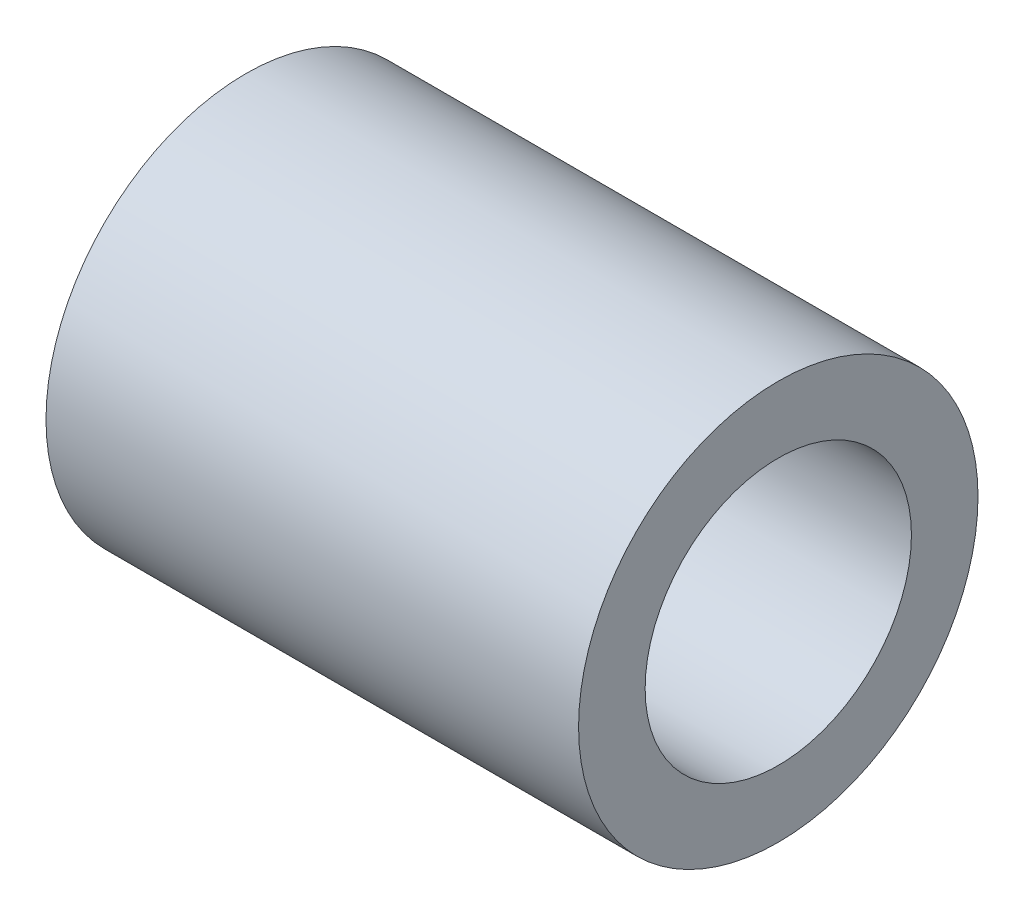
ISO-10303-21;
HEADER;
FILE_DESCRIPTION(('STEP AP214'),'2;1');
FILE_NAME('part.step','',(''),(''),'','','');
FILE_SCHEMA(('AUTOMOTIVE_DESIGN { 1 0 10303 214 1 1 1 1 }'));
ENDSEC;
DATA;
#1=APPLICATION_CONTEXT('core data for automotive mechanical design processes');
#2=APPLICATION_PROTOCOL_DEFINITION('international standard','automotive_design',2000,#1);
#3=PRODUCT_CONTEXT('',#1,'mechanical');
#4=PRODUCT('Part','Part','',(#3));
#5=PRODUCT_RELATED_PRODUCT_CATEGORY('part','',(#4));
#6=PRODUCT_DEFINITION_FORMATION('','',#4);
#7=PRODUCT_DEFINITION_CONTEXT('part definition',#1,'design');
#8=PRODUCT_DEFINITION('design','',#6,#7);
#9=PRODUCT_DEFINITION_SHAPE('','',#8);
#10=(LENGTH_UNIT() NAMED_UNIT(*) SI_UNIT(.MILLI.,.METRE.));
#11=(NAMED_UNIT(*) PLANE_ANGLE_UNIT() SI_UNIT($,.RADIAN.));
#12=(NAMED_UNIT(*) SI_UNIT($,.STERADIAN.) SOLID_ANGLE_UNIT());
#13=UNCERTAINTY_MEASURE_WITH_UNIT(LENGTH_MEASURE(1.E-05),#10,'distance_accuracy_value','');
#14=(GEOMETRIC_REPRESENTATION_CONTEXT(3) GLOBAL_UNCERTAINTY_ASSIGNED_CONTEXT((#13)) GLOBAL_UNIT_ASSIGNED_CONTEXT((#10,
#11,#12)) REPRESENTATION_CONTEXT('',''));
#15=CARTESIAN_POINT('',(0.,0.,0.));
#16=DIRECTION('',(0.,0.,1.));
#17=DIRECTION('',(1.,0.,0.));
#18=AXIS2_PLACEMENT_3D('',#15,#16,#17);
#19=CARTESIAN_POINT('',(4.7625,0.,0.));
#20=DIRECTION('',(1.,0.,0.));
#21=DIRECTION('',(0.,0.,-1.));
#22=AXIS2_PLACEMENT_3D('',#19,#20,#21);
#23=PLANE('',#22);
#24=CARTESIAN_POINT('',(4.7625,0.,0.));
#25=DIRECTION('',(1.,0.,0.));
#26=DIRECTION('',(0.,0.,-1.));
#27=AXIS2_PLACEMENT_3D('',#24,#25,#26);
#28=CIRCLE('',#27,3.571875);
#29=CARTESIAN_POINT('',(4.7625,0.,3.571875));
#30=VERTEX_POINT('',#29);
#31=EDGE_CURVE('E10',#30,#30,#28,.T.);
#32=ORIENTED_EDGE('',*,*,#31,.T.);
#33=EDGE_LOOP('',(#32));
#34=FACE_BOUND('',#33,.T.);
#35=CARTESIAN_POINT('',(4.7625,0.,0.));
#36=DIRECTION('',(1.,0.,0.));
#37=DIRECTION('',(0.,0.,-1.));
#38=AXIS2_PLACEMENT_3D('',#35,#36,#37);
#39=CIRCLE('',#38,2.38125);
#40=CARTESIAN_POINT('',(4.7625,0.,2.38125));
#41=VERTEX_POINT('',#40);
#42=EDGE_CURVE('E50',#41,#41,#39,.T.);
#43=ORIENTED_EDGE('',*,*,#42,.F.);
#44=EDGE_LOOP('',(#43));
#45=FACE_BOUND('',#44,.T.);
#46=ADVANCED_FACE('F35',(#34,#45),#23,.T.);
#47=CARTESIAN_POINT('',(-4.7625,0.,0.));
#48=DIRECTION('',(1.,0.,0.));
#49=DIRECTION('',(0.,0.,-1.));
#50=AXIS2_PLACEMENT_3D('',#47,#48,#49);
#51=PLANE('',#50);
#52=CARTESIAN_POINT('',(-4.7625,0.,0.));
#53=DIRECTION('',(1.,0.,0.));
#54=DIRECTION('',(0.,0.,-1.));
#55=AXIS2_PLACEMENT_3D('',#52,#53,#54);
#56=CIRCLE('',#55,3.571875);
#57=CARTESIAN_POINT('',(-4.7625,0.,3.571875));
#58=VERTEX_POINT('',#57);
#59=EDGE_CURVE('E39',#58,#58,#56,.T.);
#60=ORIENTED_EDGE('',*,*,#59,.F.);
#61=EDGE_LOOP('',(#60));
#62=FACE_BOUND('',#61,.T.);
#63=CARTESIAN_POINT('',(-4.7625,0.,0.));
#64=DIRECTION('',(1.,0.,0.));
#65=DIRECTION('',(0.,0.,-1.));
#66=AXIS2_PLACEMENT_3D('',#63,#64,#65);
#67=CIRCLE('',#66,2.38125);
#68=CARTESIAN_POINT('',(-4.7625,0.,2.38125));
#69=VERTEX_POINT('',#68);
#70=EDGE_CURVE('E52',#69,#69,#67,.T.);
#71=ORIENTED_EDGE('',*,*,#70,.T.);
#72=EDGE_LOOP('',(#71));
#73=FACE_BOUND('',#72,.T.);
#74=ADVANCED_FACE('F62',(#62,#73),#51,.F.);
#75=CARTESIAN_POINT('',(4.7625,0.,0.));
#76=DIRECTION('',(-1.,0.,0.));
#77=DIRECTION('',(0.,0.,1.));
#78=AXIS2_PLACEMENT_3D('',#75,#76,#77);
#79=CYLINDRICAL_SURFACE('',#78,3.571875);
#80=CARTESIAN_POINT('',(4.7625,0.,3.571875));
#81=CARTESIAN_POINT('',(4.66328125,0.,3.571875));
#82=CARTESIAN_POINT('',(4.5640625,0.,3.571875));
#83=CARTESIAN_POINT('',(4.365625,0.,3.571875));
#84=CARTESIAN_POINT('',(4.26640625,0.,3.571875));
#85=CARTESIAN_POINT('',(4.06796875,0.,3.571875));
#86=CARTESIAN_POINT('',(3.96875,0.,3.571875));
#87=CARTESIAN_POINT('',(3.7703125,0.,3.571875));
#88=CARTESIAN_POINT('',(3.67109375,0.,3.571875));
#89=CARTESIAN_POINT('',(3.47265625,0.,3.571875));
#90=CARTESIAN_POINT('',(3.3734375,0.,3.571875));
#91=CARTESIAN_POINT('',(3.175,0.,3.571875));
#92=CARTESIAN_POINT('',(3.07578125,0.,3.571875));
#93=CARTESIAN_POINT('',(2.87734375,0.,3.571875));
#94=CARTESIAN_POINT('',(2.778125,0.,3.571875));
#95=CARTESIAN_POINT('',(2.5796875,0.,3.571875));
#96=CARTESIAN_POINT('',(2.48046875,0.,3.571875));
#97=CARTESIAN_POINT('',(2.28203125,0.,3.571875));
#98=CARTESIAN_POINT('',(2.1828125,0.,3.571875));
#99=CARTESIAN_POINT('',(1.984375,0.,3.571875));
#100=CARTESIAN_POINT('',(1.88515625,0.,3.571875));
#101=CARTESIAN_POINT('',(1.68671875,0.,3.571875));
#102=CARTESIAN_POINT('',(1.5875,0.,3.571875));
#103=CARTESIAN_POINT('',(1.3890625,0.,3.571875));
#104=CARTESIAN_POINT('',(1.28984375,0.,3.571875));
#105=CARTESIAN_POINT('',(1.09140625,0.,3.571875));
#106=CARTESIAN_POINT('',(0.992187499999999,0.,3.571875));
#107=CARTESIAN_POINT('',(0.79375,0.,3.571875));
#108=CARTESIAN_POINT('',(0.69453125,0.,3.571875));
#109=CARTESIAN_POINT('',(0.49609375,0.,3.571875));
#110=CARTESIAN_POINT('',(0.396875,0.,3.571875));
#111=CARTESIAN_POINT('',(0.1984375,0.,3.571875));
#112=CARTESIAN_POINT('',(0.0992187500000001,0.,3.571875));
#113=CARTESIAN_POINT('',(-0.0992187500000001,0.,3.571875));
#114=CARTESIAN_POINT('',(-0.1984375,0.,3.571875));
#115=CARTESIAN_POINT('',(-0.396875,0.,3.571875));
#116=CARTESIAN_POINT('',(-0.49609375,0.,3.571875));
#117=CARTESIAN_POINT('',(-0.69453125,0.,3.571875));
#118=CARTESIAN_POINT('',(-0.793750000000001,0.,3.571875));
#119=CARTESIAN_POINT('',(-0.992187500000001,0.,3.571875));
#120=CARTESIAN_POINT('',(-1.09140625,0.,3.571875));
#121=CARTESIAN_POINT('',(-1.28984375,0.,3.571875));
#122=CARTESIAN_POINT('',(-1.3890625,0.,3.571875));
#123=CARTESIAN_POINT('',(-1.5875,0.,3.571875));
#124=CARTESIAN_POINT('',(-1.68671875,0.,3.571875));
#125=CARTESIAN_POINT('',(-1.88515625,0.,3.571875));
#126=CARTESIAN_POINT('',(-1.984375,0.,3.571875));
#127=CARTESIAN_POINT('',(-2.1828125,0.,3.571875));
#128=CARTESIAN_POINT('',(-2.28203125,0.,3.571875));
#129=CARTESIAN_POINT('',(-2.48046875,0.,3.571875));
#130=CARTESIAN_POINT('',(-2.5796875,0.,3.571875));
#131=CARTESIAN_POINT('',(-2.778125,0.,3.571875));
#132=CARTESIAN_POINT('',(-2.87734375,0.,3.571875));
#133=CARTESIAN_POINT('',(-3.07578125,0.,3.571875));
#134=CARTESIAN_POINT('',(-3.175,0.,3.571875));
#135=CARTESIAN_POINT('',(-3.3734375,0.,3.571875));
#136=CARTESIAN_POINT('',(-3.47265625,0.,3.571875));
#137=CARTESIAN_POINT('',(-3.67109375,0.,3.571875));
#138=CARTESIAN_POINT('',(-3.7703125,0.,3.571875));
#139=CARTESIAN_POINT('',(-3.96875,0.,3.571875));
#140=CARTESIAN_POINT('',(-4.06796875,0.,3.571875));
#141=CARTESIAN_POINT('',(-4.26640625,0.,3.571875));
#142=CARTESIAN_POINT('',(-4.365625,0.,3.571875));
#143=CARTESIAN_POINT('',(-4.5640625,0.,3.571875));
#144=CARTESIAN_POINT('',(-4.66328125,0.,3.571875));
#145=CARTESIAN_POINT('',(-4.7625,0.,3.571875));
#146=B_SPLINE_CURVE_WITH_KNOTS('',3,(#80,#81,#82,#83,#84,#85,#86,#87,#88,#89,#90,#91,#92,#93,
#94,#95,#96,#97,#98,#99,#100,#101,#102,#103,#104,#105,#106,#107,#108,#109,#110,#111,#112,#113,
#114,#115,#116,#117,#118,#119,#120,#121,#122,#123,#124,#125,#126,#127,#128,#129,#130,#131,#132,
#133,#134,#135,#136,#137,#138,#139,#140,#141,#142,#143,#144,#145),.UNSPECIFIED.,.F.,.F.,(4,2,2,
2,2,2,2,2,2,2,2,2,2,2,2,2,2,2,2,2,2,2,2,2,2,2,2,2,2,2,2,2,4),(0.,0.29765625,0.5953125,
0.892968750000001,1.190625,1.48828125,1.7859375,2.08359375,2.38125,2.67890625,2.9765625,
3.27421875,3.571875,3.86953125,4.1671875,4.46484375,4.7625,5.06015625,5.3578125,5.65546875,
5.953125,6.25078125,6.5484375,6.84609375,7.14375,7.44140625,7.7390625,8.03671875,8.334375,
8.63203125,8.9296875,9.22734375,9.525),.UNSPECIFIED.);
#147=EDGE_CURVE('BSEAM37',#30,#58,#146,.T.);
#148=ORIENTED_EDGE('',*,*,#31,.F.);
#149=ORIENTED_EDGE('',*,*,#59,.T.);
#150=ORIENTED_EDGE('',*,*,#147,.T.);
#151=ORIENTED_EDGE('',*,*,#147,.F.);
#152=EDGE_LOOP('',(#148,#150,#149,#151));
#153=FACE_BOUND('',#152,.T.);
#154=ADVANCED_FACE('F37',(#153),#79,.T.);
#155=CARTESIAN_POINT('',(4.7625,0.,0.));
#156=DIRECTION('',(-1.,0.,0.));
#157=DIRECTION('',(0.,0.,1.));
#158=AXIS2_PLACEMENT_3D('',#155,#156,#157);
#159=CYLINDRICAL_SURFACE('',#158,2.38125);
#160=CARTESIAN_POINT('',(4.7625,0.,2.38125));
#161=CARTESIAN_POINT('',(4.66328125,0.,2.38125));
#162=CARTESIAN_POINT('',(4.5640625,0.,2.38125));
#163=CARTESIAN_POINT('',(4.365625,0.,2.38125));
#164=CARTESIAN_POINT('',(4.26640625,0.,2.38125));
#165=CARTESIAN_POINT('',(4.06796875,0.,2.38125));
#166=CARTESIAN_POINT('',(3.96875,0.,2.38125));
#167=CARTESIAN_POINT('',(3.7703125,0.,2.38125));
#168=CARTESIAN_POINT('',(3.67109375,0.,2.38125));
#169=CARTESIAN_POINT('',(3.47265625,0.,2.38125));
#170=CARTESIAN_POINT('',(3.3734375,0.,2.38125));
#171=CARTESIAN_POINT('',(3.175,0.,2.38125));
#172=CARTESIAN_POINT('',(3.07578125,0.,2.38125));
#173=CARTESIAN_POINT('',(2.87734375,0.,2.38125));
#174=CARTESIAN_POINT('',(2.778125,0.,2.38125));
#175=CARTESIAN_POINT('',(2.5796875,0.,2.38125));
#176=CARTESIAN_POINT('',(2.48046875,0.,2.38125));
#177=CARTESIAN_POINT('',(2.28203125,0.,2.38125));
#178=CARTESIAN_POINT('',(2.1828125,0.,2.38125));
#179=CARTESIAN_POINT('',(1.984375,0.,2.38125));
#180=CARTESIAN_POINT('',(1.88515625,0.,2.38125));
#181=CARTESIAN_POINT('',(1.68671875,0.,2.38125));
#182=CARTESIAN_POINT('',(1.5875,0.,2.38125));
#183=CARTESIAN_POINT('',(1.3890625,0.,2.38125));
#184=CARTESIAN_POINT('',(1.28984375,0.,2.38125));
#185=CARTESIAN_POINT('',(1.09140625,0.,2.38125));
#186=CARTESIAN_POINT('',(0.992187499999999,0.,2.38125));
#187=CARTESIAN_POINT('',(0.79375,0.,2.38125));
#188=CARTESIAN_POINT('',(0.69453125,0.,2.38125));
#189=CARTESIAN_POINT('',(0.49609375,0.,2.38125));
#190=CARTESIAN_POINT('',(0.396875,0.,2.38125));
#191=CARTESIAN_POINT('',(0.1984375,0.,2.38125));
#192=CARTESIAN_POINT('',(0.0992187500000001,0.,2.38125));
#193=CARTESIAN_POINT('',(-0.0992187500000001,0.,2.38125));
#194=CARTESIAN_POINT('',(-0.1984375,0.,2.38125));
#195=CARTESIAN_POINT('',(-0.396875,0.,2.38125));
#196=CARTESIAN_POINT('',(-0.49609375,0.,2.38125));
#197=CARTESIAN_POINT('',(-0.69453125,0.,2.38125));
#198=CARTESIAN_POINT('',(-0.793750000000001,0.,2.38125));
#199=CARTESIAN_POINT('',(-0.992187500000001,0.,2.38125));
#200=CARTESIAN_POINT('',(-1.09140625,0.,2.38125));
#201=CARTESIAN_POINT('',(-1.28984375,0.,2.38125));
#202=CARTESIAN_POINT('',(-1.3890625,0.,2.38125));
#203=CARTESIAN_POINT('',(-1.5875,0.,2.38125));
#204=CARTESIAN_POINT('',(-1.68671875,0.,2.38125));
#205=CARTESIAN_POINT('',(-1.88515625,0.,2.38125));
#206=CARTESIAN_POINT('',(-1.984375,0.,2.38125));
#207=CARTESIAN_POINT('',(-2.1828125,0.,2.38125));
#208=CARTESIAN_POINT('',(-2.28203125,0.,2.38125));
#209=CARTESIAN_POINT('',(-2.48046875,0.,2.38125));
#210=CARTESIAN_POINT('',(-2.5796875,0.,2.38125));
#211=CARTESIAN_POINT('',(-2.778125,0.,2.38125));
#212=CARTESIAN_POINT('',(-2.87734375,0.,2.38125));
#213=CARTESIAN_POINT('',(-3.07578125,0.,2.38125));
#214=CARTESIAN_POINT('',(-3.175,0.,2.38125));
#215=CARTESIAN_POINT('',(-3.3734375,0.,2.38125));
#216=CARTESIAN_POINT('',(-3.47265625,0.,2.38125));
#217=CARTESIAN_POINT('',(-3.67109375,0.,2.38125));
#218=CARTESIAN_POINT('',(-3.7703125,0.,2.38125));
#219=CARTESIAN_POINT('',(-3.96875,0.,2.38125));
#220=CARTESIAN_POINT('',(-4.06796875,0.,2.38125));
#221=CARTESIAN_POINT('',(-4.26640625,0.,2.38125));
#222=CARTESIAN_POINT('',(-4.365625,0.,2.38125));
#223=CARTESIAN_POINT('',(-4.5640625,0.,2.38125));
#224=CARTESIAN_POINT('',(-4.66328125,0.,2.38125));
#225=CARTESIAN_POINT('',(-4.7625,0.,2.38125));
#226=B_SPLINE_CURVE_WITH_KNOTS('',3,(#160,#161,#162,#163,#164,#165,#166,#167,#168,#169,#170,
#171,#172,#173,#174,#175,#176,#177,#178,#179,#180,#181,#182,#183,#184,#185,#186,#187,#188,#189,
#190,#191,#192,#193,#194,#195,#196,#197,#198,#199,#200,#201,#202,#203,#204,#205,#206,#207,#208,
#209,#210,#211,#212,#213,#214,#215,#216,#217,#218,#219,#220,#221,#222,#223,#224,#225),
.UNSPECIFIED.,.F.,.F.,(4,2,2,2,2,2,2,2,2,2,2,2,2,2,2,2,2,2,2,2,2,2,2,2,2,2,2,2,2,2,2,2,4),(0.,
0.29765625,0.5953125,0.892968750000001,1.190625,1.48828125,1.7859375,2.08359375,2.38125,
2.67890625,2.9765625,3.27421875,3.571875,3.86953125,4.1671875,4.46484375,4.7625,5.06015625,
5.3578125,5.65546875,5.953125,6.25078125,6.5484375,6.84609375,7.14375,7.44140625,7.7390625,
8.03671875,8.334375,8.63203125,8.9296875,9.22734375,9.525),.UNSPECIFIED.);
#227=EDGE_CURVE('BSEAM58',#41,#69,#226,.T.);
#228=ORIENTED_EDGE('',*,*,#42,.T.);
#229=ORIENTED_EDGE('',*,*,#70,.F.);
#230=ORIENTED_EDGE('',*,*,#227,.T.);
#231=ORIENTED_EDGE('',*,*,#227,.F.);
#232=EDGE_LOOP('',(#228,#230,#229,#231));
#233=FACE_BOUND('',#232,.T.);
#234=ADVANCED_FACE('F58',(#233),#159,.F.);
#235=CLOSED_SHELL('',(#46,#74,#154,#234));
#236=MANIFOLD_SOLID_BREP('B2',#235);
#237=ADVANCED_BREP_SHAPE_REPRESENTATION('',(#18,#236),#14);
#238=SHAPE_DEFINITION_REPRESENTATION(#9,#237);
ENDSEC;
END-ISO-10303-21;
